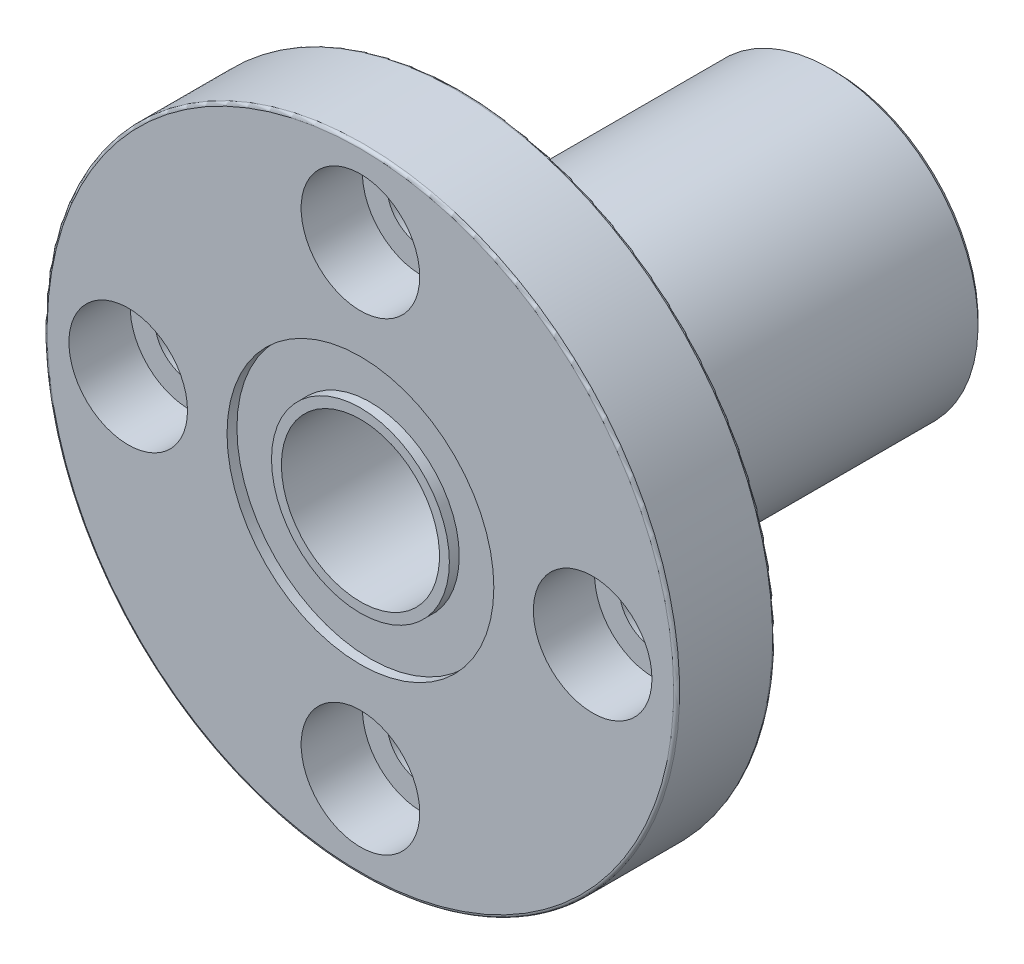
ISO-10303-21;
HEADER;
FILE_DESCRIPTION(('STEP AP214'),'2;1');
FILE_NAME('part.step','',(''),(''),'','','');
FILE_SCHEMA(('AUTOMOTIVE_DESIGN { 1 0 10303 214 1 1 1 1 }'));
ENDSEC;
DATA;
#1=APPLICATION_CONTEXT('core data for automotive mechanical design processes');
#2=APPLICATION_PROTOCOL_DEFINITION('international standard','automotive_design',2000,#1);
#3=PRODUCT_CONTEXT('',#1,'mechanical');
#4=PRODUCT('Part','Part','',(#3));
#5=PRODUCT_RELATED_PRODUCT_CATEGORY('part','',(#4));
#6=PRODUCT_DEFINITION_FORMATION('','',#4);
#7=PRODUCT_DEFINITION_CONTEXT('part definition',#1,'design');
#8=PRODUCT_DEFINITION('design','',#6,#7);
#9=PRODUCT_DEFINITION_SHAPE('','',#8);
#10=(LENGTH_UNIT() NAMED_UNIT(*) SI_UNIT(.MILLI.,.METRE.));
#11=(NAMED_UNIT(*) PLANE_ANGLE_UNIT() SI_UNIT($,.RADIAN.));
#12=(NAMED_UNIT(*) SI_UNIT($,.STERADIAN.) SOLID_ANGLE_UNIT());
#13=UNCERTAINTY_MEASURE_WITH_UNIT(LENGTH_MEASURE(1.E-05),#10,'distance_accuracy_value','');
#14=(GEOMETRIC_REPRESENTATION_CONTEXT(3) GLOBAL_UNCERTAINTY_ASSIGNED_CONTEXT((#13)) GLOBAL_UNIT_ASSIGNED_CONTEXT((#10,
#11,#12)) REPRESENTATION_CONTEXT('',''));
#15=CARTESIAN_POINT('',(0.,0.,0.));
#16=DIRECTION('',(0.,0.,1.));
#17=DIRECTION('',(1.,0.,0.));
#18=AXIS2_PLACEMENT_3D('',#15,#16,#17);
#19=CARTESIAN_POINT('',(0.,0.,11.85));
#20=DIRECTION('',(0.,0.,-1.));
#21=DIRECTION('',(-1.,0.,0.));
#22=AXIS2_PLACEMENT_3D('',#19,#20,#21);
#23=TOROIDAL_SURFACE('',#22,15.85,0.15);
#24=CARTESIAN_POINT('',(0.,0.,12.));
#25=DIRECTION('',(0.,0.,-1.));
#26=DIRECTION('',(0.,-1.,0.));
#27=AXIS2_PLACEMENT_3D('',#24,#25,#26);
#28=CIRCLE('',#27,15.85);
#29=CARTESIAN_POINT('',(0.,15.85,12.));
#30=VERTEX_POINT('',#29);
#31=EDGE_CURVE('E10',#30,#30,#28,.T.);
#32=ORIENTED_EDGE('',*,*,#31,.T.);
#33=EDGE_LOOP('',(#32));
#34=FACE_BOUND('',#33,.T.);
#35=CARTESIAN_POINT('',(0.,0.,11.85));
#36=DIRECTION('',(0.,0.,1.));
#37=DIRECTION('',(0.,-1.,0.));
#38=AXIS2_PLACEMENT_3D('',#35,#36,#37);
#39=CIRCLE('',#38,16.);
#40=CARTESIAN_POINT('',(0.,16.,11.85));
#41=VERTEX_POINT('',#40);
#42=EDGE_CURVE('E28',#41,#41,#39,.T.);
#43=ORIENTED_EDGE('',*,*,#42,.T.);
#44=EDGE_LOOP('',(#43));
#45=FACE_BOUND('',#44,.T.);
#46=ADVANCED_FACE('F17',(#34,#45),#23,.T.);
#47=CARTESIAN_POINT('',(0.,0.,9.5));
#48=DIRECTION('',(0.,0.,-1.));
#49=DIRECTION('',(0.,1.,0.));
#50=AXIS2_PLACEMENT_3D('',#47,#48,#49);
#51=CYLINDRICAL_SURFACE('',#50,16.);
#52=CARTESIAN_POINT('',(0.,0.,7.15));
#53=DIRECTION('',(0.,0.,-1.));
#54=DIRECTION('',(0.,-1.,0.));
#55=AXIS2_PLACEMENT_3D('',#52,#53,#54);
#56=CIRCLE('',#55,16.);
#57=CARTESIAN_POINT('',(0.,16.,7.15));
#58=VERTEX_POINT('',#57);
#59=EDGE_CURVE('E741',#58,#58,#56,.T.);
#60=ORIENTED_EDGE('',*,*,#59,.F.);
#61=EDGE_LOOP('',(#60));
#62=FACE_BOUND('',#61,.T.);
#63=ORIENTED_EDGE('',*,*,#42,.F.);
#64=EDGE_LOOP('',(#63));
#65=FACE_BOUND('',#64,.T.);
#66=ADVANCED_FACE('F270',(#62,#65),#51,.T.);
#67=CARTESIAN_POINT('',(0.,16.,12.));
#68=DIRECTION('',(0.,0.,1.));
#69=DIRECTION('',(1.,0.,0.));
#70=AXIS2_PLACEMENT_3D('',#67,#68,#69);
#71=PLANE('',#70);
#72=ORIENTED_EDGE('',*,*,#31,.F.);
#73=EDGE_LOOP('',(#72));
#74=FACE_BOUND('',#73,.T.);
#75=CARTESIAN_POINT('',(0.,11.75,12.));
#76=DIRECTION('',(0.,0.,-1.));
#77=DIRECTION('',(-1.,0.,0.));
#78=AXIS2_PLACEMENT_3D('',#75,#76,#77);
#79=CIRCLE('',#78,3.);
#80=CARTESIAN_POINT('',(3.,11.75,12.));
#81=VERTEX_POINT('',#80);
#82=EDGE_CURVE('E701',#81,#81,#79,.T.);
#83=ORIENTED_EDGE('',*,*,#82,.T.);
#84=EDGE_LOOP('',(#83));
#85=FACE_BOUND('',#84,.T.);
#86=CARTESIAN_POINT('',(0.,-11.75,12.));
#87=DIRECTION('',(0.,0.,-1.));
#88=DIRECTION('',(-1.,0.,0.));
#89=AXIS2_PLACEMENT_3D('',#86,#87,#88);
#90=CIRCLE('',#89,3.);
#91=CARTESIAN_POINT('',(3.,-11.75,12.));
#92=VERTEX_POINT('',#91);
#93=EDGE_CURVE('E709',#92,#92,#90,.T.);
#94=ORIENTED_EDGE('',*,*,#93,.T.);
#95=EDGE_LOOP('',(#94));
#96=FACE_BOUND('',#95,.T.);
#97=CARTESIAN_POINT('',(-11.75,0.,12.));
#98=DIRECTION('',(0.,0.,-1.));
#99=DIRECTION('',(-1.,0.,0.));
#100=AXIS2_PLACEMENT_3D('',#97,#98,#99);
#101=CIRCLE('',#100,3.);
#102=CARTESIAN_POINT('',(-8.75,0.,12.));
#103=VERTEX_POINT('',#102);
#104=EDGE_CURVE('E717',#103,#103,#101,.T.);
#105=ORIENTED_EDGE('',*,*,#104,.T.);
#106=EDGE_LOOP('',(#105));
#107=FACE_BOUND('',#106,.T.);
#108=CARTESIAN_POINT('',(11.75,0.,12.));
#109=DIRECTION('',(0.,0.,-1.));
#110=DIRECTION('',(-1.,0.,0.));
#111=AXIS2_PLACEMENT_3D('',#108,#109,#110);
#112=CIRCLE('',#111,3.);
#113=CARTESIAN_POINT('',(14.75,0.,12.));
#114=VERTEX_POINT('',#113);
#115=EDGE_CURVE('E725',#114,#114,#112,.T.);
#116=ORIENTED_EDGE('',*,*,#115,.T.);
#117=EDGE_LOOP('',(#116));
#118=FACE_BOUND('',#117,.T.);
#119=CARTESIAN_POINT('',(0.,0.,12.));
#120=DIRECTION('',(0.,0.,-1.));
#121=DIRECTION('',(1.,0.,0.));
#122=AXIS2_PLACEMENT_3D('',#119,#120,#121);
#123=CIRCLE('',#122,6.75);
#124=CARTESIAN_POINT('',(-6.75,0.,12.));
#125=VERTEX_POINT('',#124);
#126=EDGE_CURVE('E733',#125,#125,#123,.T.);
#127=ORIENTED_EDGE('',*,*,#126,.T.);
#128=EDGE_LOOP('',(#127));
#129=FACE_BOUND('',#128,.T.);
#130=ADVANCED_FACE('F276',(#74,#85,#96,#107,#118,#129),#71,.T.);
#131=CARTESIAN_POINT('',(0.,0.,7.15));
#132=DIRECTION('',(0.,0.,-1.));
#133=DIRECTION('',(-1.,0.,0.));
#134=AXIS2_PLACEMENT_3D('',#131,#132,#133);
#135=TOROIDAL_SURFACE('',#134,15.85,0.15);
#136=ORIENTED_EDGE('',*,*,#59,.T.);
#137=EDGE_LOOP('',(#136));
#138=FACE_BOUND('',#137,.T.);
#139=CARTESIAN_POINT('',(0.,0.,7.));
#140=DIRECTION('',(0.,0.,1.));
#141=DIRECTION('',(0.,-1.,0.));
#142=AXIS2_PLACEMENT_3D('',#139,#140,#141);
#143=CIRCLE('',#142,15.85);
#144=CARTESIAN_POINT('',(0.,15.85,7.));
#145=VERTEX_POINT('',#144);
#146=EDGE_CURVE('E749',#145,#145,#143,.T.);
#147=ORIENTED_EDGE('',*,*,#146,.T.);
#148=EDGE_LOOP('',(#147));
#149=FACE_BOUND('',#148,.T.);
#150=ADVANCED_FACE('F310',(#138,#149),#135,.T.);
#151=CARTESIAN_POINT('',(0.,7.5,7.));
#152=DIRECTION('',(0.,0.,-1.));
#153=DIRECTION('',(0.,-1.,0.));
#154=AXIS2_PLACEMENT_3D('',#151,#152,#153);
#155=PLANE('',#154);
#156=ORIENTED_EDGE('',*,*,#146,.F.);
#157=EDGE_LOOP('',(#156));
#158=FACE_BOUND('',#157,.T.);
#159=CARTESIAN_POINT('',(0.,0.,7.));
#160=DIRECTION('',(0.,0.,-1.));
#161=DIRECTION('',(1.,0.,0.));
#162=AXIS2_PLACEMENT_3D('',#159,#160,#161);
#163=CIRCLE('',#162,7.5);
#164=CARTESIAN_POINT('',(0.,7.5,7.));
#165=VERTEX_POINT('',#164);
#166=EDGE_CURVE('E341',#165,#165,#163,.T.);
#167=ORIENTED_EDGE('',*,*,#166,.F.);
#168=EDGE_LOOP('',(#167));
#169=FACE_BOUND('',#168,.T.);
#170=CARTESIAN_POINT('',(-11.75,0.,7.));
#171=DIRECTION('',(0.,0.,1.));
#172=DIRECTION('',(1.,0.,0.));
#173=AXIS2_PLACEMENT_3D('',#170,#171,#172);
#174=CIRCLE('',#173,1.75);
#175=CARTESIAN_POINT('',(-13.5,0.,7.));
#176=VERTEX_POINT('',#175);
#177=EDGE_CURVE('E756',#176,#176,#174,.T.);
#178=ORIENTED_EDGE('',*,*,#177,.T.);
#179=EDGE_LOOP('',(#178));
#180=FACE_BOUND('',#179,.T.);
#181=CARTESIAN_POINT('',(11.75,0.,7.));
#182=DIRECTION('',(0.,0.,1.));
#183=DIRECTION('',(1.,0.,0.));
#184=AXIS2_PLACEMENT_3D('',#181,#182,#183);
#185=CIRCLE('',#184,1.75);
#186=CARTESIAN_POINT('',(10.,0.,7.));
#187=VERTEX_POINT('',#186);
#188=EDGE_CURVE('E765',#187,#187,#185,.T.);
#189=ORIENTED_EDGE('',*,*,#188,.T.);
#190=EDGE_LOOP('',(#189));
#191=FACE_BOUND('',#190,.T.);
#192=CARTESIAN_POINT('',(0.,11.75,7.));
#193=DIRECTION('',(0.,0.,1.));
#194=DIRECTION('',(1.,0.,0.));
#195=AXIS2_PLACEMENT_3D('',#192,#193,#194);
#196=CIRCLE('',#195,1.75);
#197=CARTESIAN_POINT('',(-1.75,11.75,7.));
#198=VERTEX_POINT('',#197);
#199=EDGE_CURVE('E352',#198,#198,#196,.T.);
#200=ORIENTED_EDGE('',*,*,#199,.T.);
#201=EDGE_LOOP('',(#200));
#202=FACE_BOUND('',#201,.T.);
#203=CARTESIAN_POINT('',(0.,-11.75,7.));
#204=DIRECTION('',(0.,0.,1.));
#205=DIRECTION('',(1.,0.,0.));
#206=AXIS2_PLACEMENT_3D('',#203,#204,#205);
#207=CIRCLE('',#206,1.75);
#208=CARTESIAN_POINT('',(-1.75,-11.75,7.));
#209=VERTEX_POINT('',#208);
#210=EDGE_CURVE('E345',#209,#209,#207,.T.);
#211=ORIENTED_EDGE('',*,*,#210,.T.);
#212=EDGE_LOOP('',(#211));
#213=FACE_BOUND('',#212,.T.);
#214=ADVANCED_FACE('F313',(#158,#169,#180,#191,#202,#213),#155,.T.);
#215=CARTESIAN_POINT('',(0.,0.,-11.875));
#216=DIRECTION('',(0.,0.,1.));
#217=DIRECTION('',(0.,-1.,0.));
#218=AXIS2_PLACEMENT_3D('',#215,#216,#217);
#219=CONICAL_SURFACE('',#218,7.375,0.78539816339999);
#220=CARTESIAN_POINT('',(0.,0.,-11.75));
#221=DIRECTION('',(0.,0.,-1.));
#222=DIRECTION('',(0.,-1.,0.));
#223=AXIS2_PLACEMENT_3D('',#220,#221,#222);
#224=CIRCLE('',#223,7.5);
#225=CARTESIAN_POINT('',(0.,7.5,-11.75));
#226=VERTEX_POINT('',#225);
#227=EDGE_CURVE('E343',#226,#226,#224,.T.);
#228=ORIENTED_EDGE('',*,*,#227,.T.);
#229=EDGE_LOOP('',(#228));
#230=FACE_BOUND('',#229,.T.);
#231=CARTESIAN_POINT('',(0.,0.,-12.));
#232=DIRECTION('',(0.,0.,1.));
#233=DIRECTION('',(0.,-1.,0.));
#234=AXIS2_PLACEMENT_3D('',#231,#232,#233);
#235=CIRCLE('',#234,7.25);
#236=CARTESIAN_POINT('',(0.,7.25,-12.));
#237=VERTEX_POINT('',#236);
#238=EDGE_CURVE('E346',#237,#237,#235,.T.);
#239=ORIENTED_EDGE('',*,*,#238,.T.);
#240=EDGE_LOOP('',(#239));
#241=FACE_BOUND('',#240,.T.);
#242=ADVANCED_FACE('F321',(#230,#241),#219,.T.);
#243=CARTESIAN_POINT('',(0.,0.,-2.5));
#244=DIRECTION('',(0.,0.,-1.));
#245=DIRECTION('',(0.,1.,0.));
#246=AXIS2_PLACEMENT_3D('',#243,#244,#245);
#247=CYLINDRICAL_SURFACE('',#246,7.5);
#248=ORIENTED_EDGE('',*,*,#166,.T.);
#249=EDGE_LOOP('',(#248));
#250=FACE_BOUND('',#249,.T.);
#251=ORIENTED_EDGE('',*,*,#227,.F.);
#252=EDGE_LOOP('',(#251));
#253=FACE_BOUND('',#252,.T.);
#254=ADVANCED_FACE('F330',(#250,#253),#247,.T.);
#255=CARTESIAN_POINT('',(0.,0.,-12.));
#256=DIRECTION('',(0.,0.,-1.));
#257=DIRECTION('',(0.,-1.,0.));
#258=AXIS2_PLACEMENT_3D('',#255,#256,#257);
#259=PLANE('',#258);
#260=ORIENTED_EDGE('',*,*,#238,.F.);
#261=EDGE_LOOP('',(#260));
#262=FACE_BOUND('',#261,.T.);
#263=CARTESIAN_POINT('',(0.,0.,-12.));
#264=DIRECTION('',(0.,0.,1.));
#265=DIRECTION('',(1.,0.,0.));
#266=AXIS2_PLACEMENT_3D('',#263,#264,#265);
#267=CIRCLE('',#266,6.75);
#268=CARTESIAN_POINT('',(-6.75,0.,-12.));
#269=VERTEX_POINT('',#268);
#270=EDGE_CURVE('E359',#269,#269,#267,.T.);
#271=ORIENTED_EDGE('',*,*,#270,.T.);
#272=EDGE_LOOP('',(#271));
#273=FACE_BOUND('',#272,.T.);
#274=ADVANCED_FACE('F300',(#262,#273),#259,.T.);
#275=CARTESIAN_POINT('',(-11.75,0.,7.));
#276=DIRECTION('',(0.,0.,1.));
#277=DIRECTION('',(1.,0.,0.));
#278=AXIS2_PLACEMENT_3D('',#275,#276,#277);
#279=CYLINDRICAL_SURFACE('',#278,1.75);
#280=CARTESIAN_POINT('',(-11.75,0.,8.9));
#281=DIRECTION('',(0.,0.,1.));
#282=DIRECTION('',(1.,0.,0.));
#283=AXIS2_PLACEMENT_3D('',#280,#281,#282);
#284=CIRCLE('',#283,1.75);
#285=CARTESIAN_POINT('',(-10.,0.,8.9));
#286=VERTEX_POINT('',#285);
#287=EDGE_CURVE('E363',#286,#286,#284,.T.);
#288=ORIENTED_EDGE('',*,*,#287,.T.);
#289=EDGE_LOOP('',(#288));
#290=FACE_BOUND('',#289,.T.);
#291=ORIENTED_EDGE('',*,*,#177,.F.);
#292=EDGE_LOOP('',(#291));
#293=FACE_BOUND('',#292,.T.);
#294=ADVANCED_FACE('F296',(#290,#293),#279,.F.);
#295=CARTESIAN_POINT('',(11.75,0.,7.));
#296=DIRECTION('',(0.,0.,1.));
#297=DIRECTION('',(1.,0.,0.));
#298=AXIS2_PLACEMENT_3D('',#295,#296,#297);
#299=CYLINDRICAL_SURFACE('',#298,1.75);
#300=CARTESIAN_POINT('',(11.75,0.,8.9));
#301=DIRECTION('',(0.,0.,1.));
#302=DIRECTION('',(1.,0.,0.));
#303=AXIS2_PLACEMENT_3D('',#300,#301,#302);
#304=CIRCLE('',#303,1.75);
#305=CARTESIAN_POINT('',(13.5,0.,8.9));
#306=VERTEX_POINT('',#305);
#307=EDGE_CURVE('E366',#306,#306,#304,.T.);
#308=ORIENTED_EDGE('',*,*,#307,.T.);
#309=EDGE_LOOP('',(#308));
#310=FACE_BOUND('',#309,.T.);
#311=ORIENTED_EDGE('',*,*,#188,.F.);
#312=EDGE_LOOP('',(#311));
#313=FACE_BOUND('',#312,.T.);
#314=ADVANCED_FACE('F299',(#310,#313),#299,.F.);
#315=CARTESIAN_POINT('',(0.,11.75,7.));
#316=DIRECTION('',(0.,0.,1.));
#317=DIRECTION('',(1.,0.,0.));
#318=AXIS2_PLACEMENT_3D('',#315,#316,#317);
#319=CYLINDRICAL_SURFACE('',#318,1.75);
#320=CARTESIAN_POINT('',(0.,11.75,8.9));
#321=DIRECTION('',(0.,0.,1.));
#322=DIRECTION('',(1.,0.,0.));
#323=AXIS2_PLACEMENT_3D('',#320,#321,#322);
#324=CIRCLE('',#323,1.75);
#325=CARTESIAN_POINT('',(1.75,11.75,8.9));
#326=VERTEX_POINT('',#325);
#327=EDGE_CURVE('E198',#326,#326,#324,.T.);
#328=ORIENTED_EDGE('',*,*,#327,.T.);
#329=EDGE_LOOP('',(#328));
#330=FACE_BOUND('',#329,.T.);
#331=ORIENTED_EDGE('',*,*,#199,.F.);
#332=EDGE_LOOP('',(#331));
#333=FACE_BOUND('',#332,.T.);
#334=ADVANCED_FACE('F294',(#330,#333),#319,.F.);
#335=CARTESIAN_POINT('',(0.,-11.75,7.));
#336=DIRECTION('',(0.,0.,1.));
#337=DIRECTION('',(1.,0.,0.));
#338=AXIS2_PLACEMENT_3D('',#335,#336,#337);
#339=CYLINDRICAL_SURFACE('',#338,1.75);
#340=CARTESIAN_POINT('',(0.,-11.75,8.9));
#341=DIRECTION('',(0.,0.,1.));
#342=DIRECTION('',(1.,0.,0.));
#343=AXIS2_PLACEMENT_3D('',#340,#341,#342);
#344=CIRCLE('',#343,1.75);
#345=CARTESIAN_POINT('',(1.75,-11.75,8.9));
#346=VERTEX_POINT('',#345);
#347=EDGE_CURVE('E204',#346,#346,#344,.T.);
#348=ORIENTED_EDGE('',*,*,#347,.T.);
#349=EDGE_LOOP('',(#348));
#350=FACE_BOUND('',#349,.T.);
#351=ORIENTED_EDGE('',*,*,#210,.F.);
#352=EDGE_LOOP('',(#351));
#353=FACE_BOUND('',#352,.T.);
#354=ADVANCED_FACE('F290',(#350,#353),#339,.F.);
#355=CARTESIAN_POINT('',(0.,11.75,8.9));
#356=DIRECTION('',(0.,0.,1.));
#357=DIRECTION('',(1.,0.,0.));
#358=AXIS2_PLACEMENT_3D('',#355,#356,#357);
#359=PLANE('',#358);
#360=CARTESIAN_POINT('',(0.,11.75,8.9));
#361=DIRECTION('',(0.,0.,-1.));
#362=DIRECTION('',(-1.,0.,0.));
#363=AXIS2_PLACEMENT_3D('',#360,#361,#362);
#364=CIRCLE('',#363,3.);
#365=CARTESIAN_POINT('',(3.,11.75,8.9));
#366=VERTEX_POINT('',#365);
#367=EDGE_CURVE('E200',#366,#366,#364,.T.);
#368=ORIENTED_EDGE('',*,*,#367,.F.);
#369=EDGE_LOOP('',(#368));
#370=FACE_BOUND('',#369,.T.);
#371=ORIENTED_EDGE('',*,*,#327,.F.);
#372=EDGE_LOOP('',(#371));
#373=FACE_BOUND('',#372,.T.);
#374=ADVANCED_FACE('F293',(#370,#373),#359,.T.);
#375=CARTESIAN_POINT('',(0.,11.75,12.));
#376=DIRECTION('',(0.,0.,-1.));
#377=DIRECTION('',(-1.,0.,0.));
#378=AXIS2_PLACEMENT_3D('',#375,#376,#377);
#379=CYLINDRICAL_SURFACE('',#378,3.);
#380=ORIENTED_EDGE('',*,*,#367,.T.);
#381=EDGE_LOOP('',(#380));
#382=FACE_BOUND('',#381,.T.);
#383=ORIENTED_EDGE('',*,*,#82,.F.);
#384=EDGE_LOOP('',(#383));
#385=FACE_BOUND('',#384,.T.);
#386=ADVANCED_FACE('F327',(#382,#385),#379,.F.);
#387=CARTESIAN_POINT('',(0.,-11.75,8.9));
#388=DIRECTION('',(0.,0.,1.));
#389=DIRECTION('',(1.,0.,0.));
#390=AXIS2_PLACEMENT_3D('',#387,#388,#389);
#391=PLANE('',#390);
#392=CARTESIAN_POINT('',(0.,-11.75,8.9));
#393=DIRECTION('',(0.,0.,-1.));
#394=DIRECTION('',(-1.,0.,0.));
#395=AXIS2_PLACEMENT_3D('',#392,#393,#394);
#396=CIRCLE('',#395,3.);
#397=CARTESIAN_POINT('',(3.,-11.75,8.9));
#398=VERTEX_POINT('',#397);
#399=EDGE_CURVE('E205',#398,#398,#396,.T.);
#400=ORIENTED_EDGE('',*,*,#399,.F.);
#401=EDGE_LOOP('',(#400));
#402=FACE_BOUND('',#401,.T.);
#403=ORIENTED_EDGE('',*,*,#347,.F.);
#404=EDGE_LOOP('',(#403));
#405=FACE_BOUND('',#404,.T.);
#406=ADVANCED_FACE('F287',(#402,#405),#391,.T.);
#407=CARTESIAN_POINT('',(0.,-11.75,12.));
#408=DIRECTION('',(0.,0.,-1.));
#409=DIRECTION('',(-1.,0.,0.));
#410=AXIS2_PLACEMENT_3D('',#407,#408,#409);
#411=CYLINDRICAL_SURFACE('',#410,3.);
#412=ORIENTED_EDGE('',*,*,#399,.T.);
#413=EDGE_LOOP('',(#412));
#414=FACE_BOUND('',#413,.T.);
#415=ORIENTED_EDGE('',*,*,#93,.F.);
#416=EDGE_LOOP('',(#415));
#417=FACE_BOUND('',#416,.T.);
#418=ADVANCED_FACE('F284',(#414,#417),#411,.F.);
#419=CARTESIAN_POINT('',(-11.75,0.,8.9));
#420=DIRECTION('',(0.,0.,1.));
#421=DIRECTION('',(1.,0.,0.));
#422=AXIS2_PLACEMENT_3D('',#419,#420,#421);
#423=PLANE('',#422);
#424=CARTESIAN_POINT('',(-11.75,0.,8.9));
#425=DIRECTION('',(0.,0.,-1.));
#426=DIRECTION('',(-1.,0.,0.));
#427=AXIS2_PLACEMENT_3D('',#424,#425,#426);
#428=CIRCLE('',#427,3.);
#429=CARTESIAN_POINT('',(-8.75,0.,8.9));
#430=VERTEX_POINT('',#429);
#431=EDGE_CURVE('E209',#430,#430,#428,.T.);
#432=ORIENTED_EDGE('',*,*,#431,.F.);
#433=EDGE_LOOP('',(#432));
#434=FACE_BOUND('',#433,.T.);
#435=ORIENTED_EDGE('',*,*,#287,.F.);
#436=EDGE_LOOP('',(#435));
#437=FACE_BOUND('',#436,.T.);
#438=ADVANCED_FACE('F286',(#434,#437),#423,.T.);
#439=CARTESIAN_POINT('',(-11.75,0.,12.));
#440=DIRECTION('',(0.,0.,-1.));
#441=DIRECTION('',(-1.,0.,0.));
#442=AXIS2_PLACEMENT_3D('',#439,#440,#441);
#443=CYLINDRICAL_SURFACE('',#442,3.);
#444=ORIENTED_EDGE('',*,*,#431,.T.);
#445=EDGE_LOOP('',(#444));
#446=FACE_BOUND('',#445,.T.);
#447=ORIENTED_EDGE('',*,*,#104,.F.);
#448=EDGE_LOOP('',(#447));
#449=FACE_BOUND('',#448,.T.);
#450=ADVANCED_FACE('F317',(#446,#449),#443,.F.);
#451=CARTESIAN_POINT('',(11.75,0.,8.9));
#452=DIRECTION('',(0.,0.,1.));
#453=DIRECTION('',(1.,0.,0.));
#454=AXIS2_PLACEMENT_3D('',#451,#452,#453);
#455=PLANE('',#454);
#456=CARTESIAN_POINT('',(11.75,0.,8.9));
#457=DIRECTION('',(0.,0.,-1.));
#458=DIRECTION('',(-1.,0.,0.));
#459=AXIS2_PLACEMENT_3D('',#456,#457,#458);
#460=CIRCLE('',#459,3.);
#461=CARTESIAN_POINT('',(14.75,0.,8.9));
#462=VERTEX_POINT('',#461);
#463=EDGE_CURVE('E213',#462,#462,#460,.T.);
#464=ORIENTED_EDGE('',*,*,#463,.F.);
#465=EDGE_LOOP('',(#464));
#466=FACE_BOUND('',#465,.T.);
#467=ORIENTED_EDGE('',*,*,#307,.F.);
#468=EDGE_LOOP('',(#467));
#469=FACE_BOUND('',#468,.T.);
#470=ADVANCED_FACE('F390',(#466,#469),#455,.T.);
#471=CARTESIAN_POINT('',(11.75,0.,12.));
#472=DIRECTION('',(0.,0.,-1.));
#473=DIRECTION('',(-1.,0.,0.));
#474=AXIS2_PLACEMENT_3D('',#471,#472,#473);
#475=CYLINDRICAL_SURFACE('',#474,3.);
#476=ORIENTED_EDGE('',*,*,#463,.T.);
#477=EDGE_LOOP('',(#476));
#478=FACE_BOUND('',#477,.T.);
#479=ORIENTED_EDGE('',*,*,#115,.F.);
#480=EDGE_LOOP('',(#479));
#481=FACE_BOUND('',#480,.T.);
#482=ADVANCED_FACE('F282',(#478,#481),#475,.F.);
#483=CARTESIAN_POINT('',(0.,0.,-12.));
#484=DIRECTION('',(0.,0.,1.));
#485=DIRECTION('',(1.,0.,0.));
#486=AXIS2_PLACEMENT_3D('',#483,#484,#485);
#487=CYLINDRICAL_SURFACE('',#486,6.75);
#488=ORIENTED_EDGE('',*,*,#270,.F.);
#489=EDGE_LOOP('',(#488));
#490=FACE_BOUND('',#489,.T.);
#491=CARTESIAN_POINT('',(0.,0.,-11.5));
#492=DIRECTION('',(0.,0.,1.));
#493=DIRECTION('',(1.,0.,0.));
#494=AXIS2_PLACEMENT_3D('',#491,#492,#493);
#495=CIRCLE('',#494,6.75);
#496=CARTESIAN_POINT('',(-6.75,0.,-11.5));
#497=VERTEX_POINT('',#496);
#498=EDGE_CURVE('E217',#497,#497,#495,.T.);
#499=ORIENTED_EDGE('',*,*,#498,.T.);
#500=EDGE_LOOP('',(#499));
#501=FACE_BOUND('',#500,.T.);
#502=ADVANCED_FACE('F395',(#490,#501),#487,.F.);
#503=CARTESIAN_POINT('',(0.,0.,-12.));
#504=DIRECTION('',(0.,0.,1.));
#505=DIRECTION('',(1.,0.,0.));
#506=AXIS2_PLACEMENT_3D('',#503,#504,#505);
#507=PLANE('',#506);
#508=CARTESIAN_POINT('',(0.,0.,-12.));
#509=DIRECTION('',(0.,0.,1.));
#510=DIRECTION('',(1.,0.,0.));
#511=AXIS2_PLACEMENT_3D('',#508,#509,#510);
#512=CIRCLE('',#511,4.5);
#513=CARTESIAN_POINT('',(-4.5,0.,-12.));
#514=VERTEX_POINT('',#513);
#515=EDGE_CURVE('E236',#514,#514,#512,.T.);
#516=ORIENTED_EDGE('',*,*,#515,.F.);
#517=EDGE_LOOP('',(#516));
#518=FACE_BOUND('',#517,.T.);
#519=CARTESIAN_POINT('',(0.,0.,-12.));
#520=DIRECTION('',(0.,0.,1.));
#521=DIRECTION('',(1.,0.,0.));
#522=AXIS2_PLACEMENT_3D('',#519,#520,#521);
#523=CIRCLE('',#522,4.);
#524=CARTESIAN_POINT('',(-4.,0.,-12.));
#525=VERTEX_POINT('',#524);
#526=EDGE_CURVE('E221',#525,#525,#523,.T.);
#527=ORIENTED_EDGE('',*,*,#526,.T.);
#528=EDGE_LOOP('',(#527));
#529=FACE_BOUND('',#528,.T.);
#530=ADVANCED_FACE('F398',(#518,#529),#507,.F.);
#531=CARTESIAN_POINT('',(0.,0.,12.));
#532=DIRECTION('',(0.,0.,1.));
#533=DIRECTION('',(1.,0.,0.));
#534=AXIS2_PLACEMENT_3D('',#531,#532,#533);
#535=PLANE('',#534);
#536=CARTESIAN_POINT('',(0.,0.,12.));
#537=DIRECTION('',(0.,0.,1.));
#538=DIRECTION('',(1.,0.,0.));
#539=AXIS2_PLACEMENT_3D('',#536,#537,#538);
#540=CIRCLE('',#539,4.5);
#541=CARTESIAN_POINT('',(-4.5,0.,12.));
#542=VERTEX_POINT('',#541);
#543=EDGE_CURVE('E228',#542,#542,#540,.T.);
#544=ORIENTED_EDGE('',*,*,#543,.T.);
#545=EDGE_LOOP('',(#544));
#546=FACE_BOUND('',#545,.T.);
#547=CARTESIAN_POINT('',(0.,0.,12.));
#548=DIRECTION('',(0.,0.,-1.));
#549=DIRECTION('',(1.,0.,0.));
#550=AXIS2_PLACEMENT_3D('',#547,#548,#549);
#551=CIRCLE('',#550,4.);
#552=CARTESIAN_POINT('',(-4.,0.,12.));
#553=VERTEX_POINT('',#552);
#554=EDGE_CURVE('E232',#553,#553,#551,.T.);
#555=ORIENTED_EDGE('',*,*,#554,.T.);
#556=EDGE_LOOP('',(#555));
#557=FACE_BOUND('',#556,.T.);
#558=ADVANCED_FACE('F402',(#546,#557),#535,.T.);
#559=CARTESIAN_POINT('',(0.,0.,-12.));
#560=DIRECTION('',(0.,0.,1.));
#561=DIRECTION('',(1.,0.,0.));
#562=AXIS2_PLACEMENT_3D('',#559,#560,#561);
#563=CYLINDRICAL_SURFACE('',#562,4.);
#564=ORIENTED_EDGE('',*,*,#554,.F.);
#565=EDGE_LOOP('',(#564));
#566=FACE_BOUND('',#565,.T.);
#567=ORIENTED_EDGE('',*,*,#526,.F.);
#568=EDGE_LOOP('',(#567));
#569=FACE_BOUND('',#568,.T.);
#570=ADVANCED_FACE('F406',(#566,#569),#563,.F.);
#571=CARTESIAN_POINT('',(0.,0.,-12.));
#572=DIRECTION('',(0.,0.,1.));
#573=DIRECTION('',(1.,0.,0.));
#574=AXIS2_PLACEMENT_3D('',#571,#572,#573);
#575=CYLINDRICAL_SURFACE('',#574,4.5);
#576=ORIENTED_EDGE('',*,*,#515,.T.);
#577=EDGE_LOOP('',(#576));
#578=FACE_BOUND('',#577,.T.);
#579=CARTESIAN_POINT('',(0.,0.,-11.5));
#580=DIRECTION('',(0.,0.,-1.));
#581=DIRECTION('',(1.,0.,0.));
#582=AXIS2_PLACEMENT_3D('',#579,#580,#581);
#583=CIRCLE('',#582,4.5);
#584=CARTESIAN_POINT('',(-4.5,0.,-11.5));
#585=VERTEX_POINT('',#584);
#586=EDGE_CURVE('E237',#585,#585,#583,.T.);
#587=ORIENTED_EDGE('',*,*,#586,.T.);
#588=EDGE_LOOP('',(#587));
#589=FACE_BOUND('',#588,.T.);
#590=ADVANCED_FACE('F325',(#578,#589),#575,.T.);
#591=CARTESIAN_POINT('',(0.,0.,-11.5));
#592=DIRECTION('',(0.,0.,1.));
#593=DIRECTION('',(1.,0.,0.));
#594=AXIS2_PLACEMENT_3D('',#591,#592,#593);
#595=PLANE('',#594);
#596=ORIENTED_EDGE('',*,*,#498,.F.);
#597=EDGE_LOOP('',(#596));
#598=FACE_BOUND('',#597,.T.);
#599=ORIENTED_EDGE('',*,*,#586,.F.);
#600=EDGE_LOOP('',(#599));
#601=FACE_BOUND('',#600,.T.);
#602=ADVANCED_FACE('F264',(#598,#601),#595,.F.);
#603=CARTESIAN_POINT('',(0.,0.,-12.));
#604=DIRECTION('',(0.,0.,1.));
#605=DIRECTION('',(1.,0.,0.));
#606=AXIS2_PLACEMENT_3D('',#603,#604,#605);
#607=CYLINDRICAL_SURFACE('',#606,6.75);
#608=ORIENTED_EDGE('',*,*,#126,.F.);
#609=EDGE_LOOP('',(#608));
#610=FACE_BOUND('',#609,.T.);
#611=CARTESIAN_POINT('',(0.,0.,11.5));
#612=DIRECTION('',(0.,0.,-1.));
#613=DIRECTION('',(1.,0.,0.));
#614=AXIS2_PLACEMENT_3D('',#611,#612,#613);
#615=CIRCLE('',#614,6.75);
#616=CARTESIAN_POINT('',(6.75,0.,11.5));
#617=VERTEX_POINT('',#616);
#618=EDGE_CURVE('E241',#617,#617,#615,.T.);
#619=ORIENTED_EDGE('',*,*,#618,.T.);
#620=EDGE_LOOP('',(#619));
#621=FACE_BOUND('',#620,.T.);
#622=ADVANCED_FACE('F249',(#610,#621),#607,.F.);
#623=CARTESIAN_POINT('',(0.,0.,-12.));
#624=DIRECTION('',(0.,0.,1.));
#625=DIRECTION('',(1.,0.,0.));
#626=AXIS2_PLACEMENT_3D('',#623,#624,#625);
#627=CYLINDRICAL_SURFACE('',#626,4.5);
#628=ORIENTED_EDGE('',*,*,#543,.F.);
#629=EDGE_LOOP('',(#628));
#630=FACE_BOUND('',#629,.T.);
#631=CARTESIAN_POINT('',(0.,0.,11.5));
#632=DIRECTION('',(0.,0.,1.));
#633=DIRECTION('',(1.,0.,0.));
#634=AXIS2_PLACEMENT_3D('',#631,#632,#633);
#635=CIRCLE('',#634,4.5);
#636=CARTESIAN_POINT('',(4.5,0.,11.5));
#637=VERTEX_POINT('',#636);
#638=EDGE_CURVE('E224',#637,#637,#635,.T.);
#639=ORIENTED_EDGE('',*,*,#638,.T.);
#640=EDGE_LOOP('',(#639));
#641=FACE_BOUND('',#640,.T.);
#642=ADVANCED_FACE('F254',(#630,#641),#627,.T.);
#643=CARTESIAN_POINT('',(0.,0.,11.5));
#644=DIRECTION('',(0.,0.,1.));
#645=DIRECTION('',(1.,0.,0.));
#646=AXIS2_PLACEMENT_3D('',#643,#644,#645);
#647=PLANE('',#646);
#648=ORIENTED_EDGE('',*,*,#618,.F.);
#649=EDGE_LOOP('',(#648));
#650=FACE_BOUND('',#649,.T.);
#651=ORIENTED_EDGE('',*,*,#638,.F.);
#652=EDGE_LOOP('',(#651));
#653=FACE_BOUND('',#652,.T.);
#654=ADVANCED_FACE('F251',(#650,#653),#647,.T.);
#655=CLOSED_SHELL('',(#46,#66,#130,#150,#214,#242,#254,#274,#294,#314,#334,#354,#374,#386,#406,
#418,#438,#450,#470,#482,#502,#530,#558,#570,#590,#602,#622,#642,#654));
#656=CARTESIAN_POINT('',(0.,0.,-12.));
#657=DIRECTION('',(0.,0.,1.));
#658=DIRECTION('',(1.,0.,0.));
#659=AXIS2_PLACEMENT_3D('',#656,#657,#658);
#660=CYLINDRICAL_SURFACE('',#659,6.75);
#661=CARTESIAN_POINT('',(0.,0.,10.5));
#662=DIRECTION('',(0.,0.,1.));
#663=DIRECTION('',(1.,0.,0.));
#664=AXIS2_PLACEMENT_3D('',#661,#662,#663);
#665=CIRCLE('',#664,6.75);
#666=CARTESIAN_POINT('',(6.75,0.,10.5));
#667=VERTEX_POINT('',#666);
#668=EDGE_CURVE('E195',#667,#667,#665,.T.);
#669=ORIENTED_EDGE('',*,*,#668,.T.);
#670=EDGE_LOOP('',(#669));
#671=FACE_BOUND('',#670,.T.);
#672=CARTESIAN_POINT('',(0.,0.,-10.5));
#673=DIRECTION('',(0.,0.,-1.));
#674=DIRECTION('',(1.,0.,0.));
#675=AXIS2_PLACEMENT_3D('',#672,#673,#674);
#676=CIRCLE('',#675,6.75);
#677=CARTESIAN_POINT('',(-6.75,0.,-10.5));
#678=VERTEX_POINT('',#677);
#679=EDGE_CURVE('E180',#678,#678,#676,.T.);
#680=ORIENTED_EDGE('',*,*,#679,.T.);
#681=EDGE_LOOP('',(#680));
#682=FACE_BOUND('',#681,.T.);
#683=ADVANCED_FACE('F408',(#671,#682),#660,.F.);
#684=CARTESIAN_POINT('',(0.,0.,-12.));
#685=DIRECTION('',(0.,0.,1.));
#686=DIRECTION('',(1.,0.,0.));
#687=AXIS2_PLACEMENT_3D('',#684,#685,#686);
#688=CYLINDRICAL_SURFACE('',#687,4.5);
#689=CARTESIAN_POINT('',(0.,0.,10.5));
#690=DIRECTION('',(0.,0.,-1.));
#691=DIRECTION('',(1.,0.,0.));
#692=AXIS2_PLACEMENT_3D('',#689,#690,#691);
#693=CIRCLE('',#692,4.5);
#694=CARTESIAN_POINT('',(4.5,0.,10.5));
#695=VERTEX_POINT('',#694);
#696=EDGE_CURVE('E191',#695,#695,#693,.T.);
#697=ORIENTED_EDGE('',*,*,#696,.T.);
#698=EDGE_LOOP('',(#697));
#699=FACE_BOUND('',#698,.T.);
#700=CARTESIAN_POINT('',(0.,0.,-10.5));
#701=DIRECTION('',(0.,0.,1.));
#702=DIRECTION('',(1.,0.,0.));
#703=AXIS2_PLACEMENT_3D('',#700,#701,#702);
#704=CIRCLE('',#703,4.5);
#705=CARTESIAN_POINT('',(-4.5,0.,-10.5));
#706=VERTEX_POINT('',#705);
#707=EDGE_CURVE('E21',#706,#706,#704,.T.);
#708=ORIENTED_EDGE('',*,*,#707,.T.);
#709=EDGE_LOOP('',(#708));
#710=FACE_BOUND('',#709,.T.);
#711=ADVANCED_FACE('F19',(#699,#710),#688,.T.);
#712=CARTESIAN_POINT('',(0.,0.,-10.5));
#713=DIRECTION('',(0.,0.,1.));
#714=DIRECTION('',(1.,0.,0.));
#715=AXIS2_PLACEMENT_3D('',#712,#713,#714);
#716=PLANE('',#715);
#717=ORIENTED_EDGE('',*,*,#679,.F.);
#718=EDGE_LOOP('',(#717));
#719=FACE_BOUND('',#718,.T.);
#720=ORIENTED_EDGE('',*,*,#707,.F.);
#721=EDGE_LOOP('',(#720));
#722=FACE_BOUND('',#721,.T.);
#723=ADVANCED_FACE('F305',(#719,#722),#716,.T.);
#724=CARTESIAN_POINT('',(0.,0.,10.5));
#725=DIRECTION('',(0.,0.,1.));
#726=DIRECTION('',(1.,0.,0.));
#727=AXIS2_PLACEMENT_3D('',#724,#725,#726);
#728=PLANE('',#727);
#729=ORIENTED_EDGE('',*,*,#668,.F.);
#730=EDGE_LOOP('',(#729));
#731=FACE_BOUND('',#730,.T.);
#732=ORIENTED_EDGE('',*,*,#696,.F.);
#733=EDGE_LOOP('',(#732));
#734=FACE_BOUND('',#733,.T.);
#735=ADVANCED_FACE('F302',(#731,#734),#728,.F.);
#736=CLOSED_SHELL('',(#683,#711,#723,#735));
#737=ORIENTED_CLOSED_SHELL('',*,#736,.T.);
#738=BREP_WITH_VOIDS('B1',#655,(#737));
#739=ADVANCED_BREP_SHAPE_REPRESENTATION('',(#18,#738),#14);
#740=SHAPE_DEFINITION_REPRESENTATION(#9,#739);
ENDSEC;
END-ISO-10303-21;
